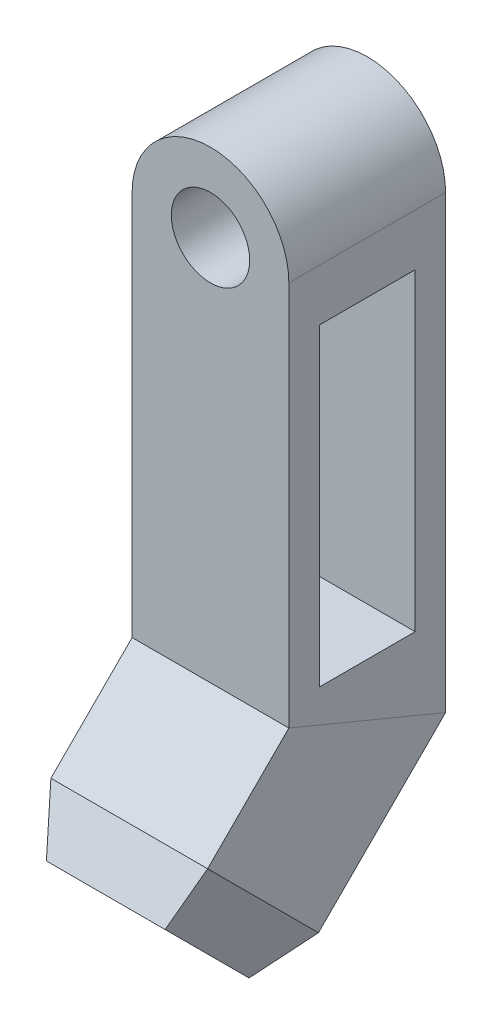
ISO-10303-21;
HEADER;
FILE_DESCRIPTION(('STEP AP214'),'2;1');
FILE_NAME('part.step','',(''),(''),'','','');
FILE_SCHEMA(('AUTOMOTIVE_DESIGN { 1 0 10303 214 1 1 1 1 }'));
ENDSEC;
DATA;
#1=APPLICATION_CONTEXT('core data for automotive mechanical design processes');
#2=APPLICATION_PROTOCOL_DEFINITION('international standard','automotive_design',2000,#1);
#3=PRODUCT_CONTEXT('',#1,'mechanical');
#4=PRODUCT('Part','Part','',(#3));
#5=PRODUCT_RELATED_PRODUCT_CATEGORY('part','',(#4));
#6=PRODUCT_DEFINITION_FORMATION('','',#4);
#7=PRODUCT_DEFINITION_CONTEXT('part definition',#1,'design');
#8=PRODUCT_DEFINITION('design','',#6,#7);
#9=PRODUCT_DEFINITION_SHAPE('','',#8);
#10=(LENGTH_UNIT() NAMED_UNIT(*) SI_UNIT(.MILLI.,.METRE.));
#11=(NAMED_UNIT(*) PLANE_ANGLE_UNIT() SI_UNIT($,.RADIAN.));
#12=(NAMED_UNIT(*) SI_UNIT($,.STERADIAN.) SOLID_ANGLE_UNIT());
#13=UNCERTAINTY_MEASURE_WITH_UNIT(LENGTH_MEASURE(1.E-05),#10,'distance_accuracy_value','');
#14=(GEOMETRIC_REPRESENTATION_CONTEXT(3) GLOBAL_UNCERTAINTY_ASSIGNED_CONTEXT((#13)) GLOBAL_UNIT_ASSIGNED_CONTEXT((#10,
#11,#12)) REPRESENTATION_CONTEXT('',''));
#15=CARTESIAN_POINT('',(0.,0.,0.));
#16=DIRECTION('',(0.,0.,1.));
#17=DIRECTION('',(1.,0.,0.));
#18=AXIS2_PLACEMENT_3D('',#15,#16,#17);
#19=CARTESIAN_POINT('',(19.05,14.4716722599583,7.26209610324911));
#20=DIRECTION('',(-1.,0.,0.));
#21=DIRECTION('',(0.,0.,1.));
#22=AXIS2_PLACEMENT_3D('',#19,#20,#21);
#23=PLANE('',#22);
#24=DIRECTION('',(0.,0.382683432365091,0.923879532511287));
#25=VECTOR('',#24,1.);
#26=CARTESIAN_POINT('',(19.05,16.4071676065253,52.1812165750785));
#27=LINE('',#26,#25);
#28=CARTESIAN_POINT('',(19.05,-13.0977683632075,-19.05));
#29=VERTEX_POINT('',#28);
#30=CARTESIAN_POINT('',(19.05,2.68376836320748,19.05));
#31=VERTEX_POINT('',#30);
#32=EDGE_CURVE('E244',#29,#31,#27,.T.);
#33=ORIENTED_EDGE('',*,*,#32,.T.);
#34=DIRECTION('',(0.,-0.707106781186546,0.707106781186549));
#35=VECTOR('',#34,1.);
#36=CARTESIAN_POINT('',(19.05,14.4716722599583,7.26209610324911));
#37=LINE('',#36,#35);
#38=CARTESIAN_POINT('',(19.05,-17.0609380798112,38.7947064430187));
#39=VERTEX_POINT('',#38);
#40=EDGE_CURVE('E49',#31,#39,#37,.T.);
#41=ORIENTED_EDGE('',*,*,#40,.T.);
#42=DIRECTION('',(0.,-0.707106781186549,-0.707106781186546));
#43=VECTOR('',#42,1.);
#44=CARTESIAN_POINT('',(19.05,-17.0609380798112,38.7947064430187));
#45=LINE('',#44,#43);
#46=CARTESIAN_POINT('',(19.05,-44.0017064430187,11.8539380798113));
#47=VERTEX_POINT('',#46);
#48=EDGE_CURVE('E283',#39,#47,#45,.T.);
#49=ORIENTED_EDGE('',*,*,#48,.T.);
#50=DIRECTION('',(0.,-0.707106781186546,0.707106781186549));
#51=VECTOR('',#50,1.);
#52=CARTESIAN_POINT('',(19.05,-12.4690961032492,-19.6786722599583));
#53=LINE('',#52,#51);
#54=EDGE_CURVE('E294',#29,#47,#53,.T.);
#55=ORIENTED_EDGE('',*,*,#54,.F.);
#56=EDGE_LOOP('',(#33,#41,#49,#55));
#57=FACE_BOUND('',#56,.T.);
#58=ADVANCED_FACE('F45',(#57),#23,.F.);
#59=CARTESIAN_POINT('',(-19.05,-12.4690961032492,-19.6786722599583));
#60=DIRECTION('',(0.,0.707106781186549,0.707106781186546));
#61=DIRECTION('',(0.,-0.707106781186546,0.707106781186549));
#62=AXIS2_PLACEMENT_3D('',#59,#60,#61);
#63=PLANE('',#62);
#64=DIRECTION('',(1.,0.,0.));
#65=VECTOR('',#64,1.);
#66=CARTESIAN_POINT('',(-19.05,-13.0977683632075,-19.05));
#67=LINE('',#66,#65);
#68=CARTESIAN_POINT('',(-19.05,-13.0977683632075,-19.05));
#69=VERTEX_POINT('',#68);
#70=EDGE_CURVE('E11',#69,#29,#67,.T.);
#71=ORIENTED_EDGE('',*,*,#70,.T.);
#72=ORIENTED_EDGE('',*,*,#54,.T.);
#73=DIRECTION('',(-1.,0.,0.));
#74=VECTOR('',#73,1.);
#75=CARTESIAN_POINT('',(-19.05,-44.0017064430187,11.8539380798113));
#76=LINE('',#75,#74);
#77=CARTESIAN_POINT('',(-19.05,-44.0017064430187,11.8539380798113));
#78=VERTEX_POINT('',#77);
#79=EDGE_CURVE('E279',#47,#78,#76,.T.);
#80=ORIENTED_EDGE('',*,*,#79,.T.);
#81=DIRECTION('',(0.,-0.707106781186546,0.707106781186549));
#82=VECTOR('',#81,1.);
#83=CARTESIAN_POINT('',(-19.05,-12.4690961032492,-19.6786722599583));
#84=LINE('',#83,#82);
#85=EDGE_CURVE('E291',#69,#78,#84,.T.);
#86=ORIENTED_EDGE('',*,*,#85,.F.);
#87=EDGE_LOOP('',(#71,#72,#80,#86));
#88=FACE_BOUND('',#87,.T.);
#89=ADVANCED_FACE('F322',(#88),#63,.F.);
#90=CARTESIAN_POINT('',(-19.05,14.4716722599583,7.26209610324911));
#91=DIRECTION('',(1.,0.,0.));
#92=DIRECTION('',(0.,0.,-1.));
#93=AXIS2_PLACEMENT_3D('',#90,#91,#92);
#94=PLANE('',#93);
#95=DIRECTION('',(0.,-0.382683432365091,-0.923879532511287));
#96=VECTOR('',#95,1.);
#97=CARTESIAN_POINT('',(-19.05,16.4071676065253,52.1812165750785));
#98=LINE('',#97,#96);
#99=CARTESIAN_POINT('',(-19.05,2.68376836320748,19.05));
#100=VERTEX_POINT('',#99);
#101=EDGE_CURVE('E55',#100,#69,#98,.T.);
#102=ORIENTED_EDGE('',*,*,#101,.T.);
#103=ORIENTED_EDGE('',*,*,#85,.T.);
#104=DIRECTION('',(0.,0.707106781186549,0.707106781186546));
#105=VECTOR('',#104,1.);
#106=CARTESIAN_POINT('',(-19.05,-17.0609380798112,38.7947064430187));
#107=LINE('',#106,#105);
#108=CARTESIAN_POINT('',(-19.05,-17.0609380798112,38.7947064430187));
#109=VERTEX_POINT('',#108);
#110=EDGE_CURVE('E275',#78,#109,#107,.T.);
#111=ORIENTED_EDGE('',*,*,#110,.T.);
#112=DIRECTION('',(0.,-0.707106781186546,0.707106781186549));
#113=VECTOR('',#112,1.);
#114=CARTESIAN_POINT('',(-19.05,14.4716722599583,7.26209610324911));
#115=LINE('',#114,#113);
#116=EDGE_CURVE('E287',#100,#109,#115,.T.);
#117=ORIENTED_EDGE('',*,*,#116,.F.);
#118=EDGE_LOOP('',(#102,#103,#111,#117));
#119=FACE_BOUND('',#118,.T.);
#120=ADVANCED_FACE('F313',(#119),#94,.F.);
#121=CARTESIAN_POINT('',(-19.05,14.4716722599583,7.26209610324911));
#122=DIRECTION('',(0.,-0.707106781186549,-0.707106781186546));
#123=DIRECTION('',(0.,0.707106781186546,-0.707106781186549));
#124=AXIS2_PLACEMENT_3D('',#121,#122,#123);
#125=PLANE('',#124);
#126=DIRECTION('',(-1.,0.,0.));
#127=VECTOR('',#126,1.);
#128=CARTESIAN_POINT('',(-19.05,2.68376836320748,19.05));
#129=LINE('',#128,#127);
#130=EDGE_CURVE('E240',#31,#100,#129,.T.);
#131=ORIENTED_EDGE('',*,*,#130,.T.);
#132=ORIENTED_EDGE('',*,*,#116,.T.);
#133=DIRECTION('',(1.,0.,0.));
#134=VECTOR('',#133,1.);
#135=CARTESIAN_POINT('',(-19.05,-17.0609380798112,38.7947064430187));
#136=LINE('',#135,#134);
#137=EDGE_CURVE('E213',#109,#39,#136,.T.);
#138=ORIENTED_EDGE('',*,*,#137,.T.);
#139=ORIENTED_EDGE('',*,*,#40,.F.);
#140=EDGE_LOOP('',(#131,#132,#138,#139));
#141=FACE_BOUND('',#140,.T.);
#142=ADVANCED_FACE('F47',(#141),#125,.F.);
#143=CARTESIAN_POINT('',(-19.05,96.393,19.05));
#144=DIRECTION('',(0.,0.,-1.));
#145=DIRECTION('',(0.,1.,0.));
#146=AXIS2_PLACEMENT_3D('',#143,#144,#145);
#147=PLANE('',#146);
#148=CARTESIAN_POINT('',(0.,96.393,19.05));
#149=DIRECTION('',(0.,0.,1.));
#150=DIRECTION('',(1.,0.,0.));
#151=AXIS2_PLACEMENT_3D('',#148,#149,#150);
#152=CIRCLE('',#151,9.525);
#153=CARTESIAN_POINT('',(9.525,96.393,19.05));
#154=VERTEX_POINT('',#153);
#155=EDGE_CURVE('E190',#154,#154,#152,.T.);
#156=ORIENTED_EDGE('',*,*,#155,.F.);
#157=EDGE_LOOP('',(#156));
#158=FACE_BOUND('',#157,.T.);
#159=DIRECTION('',(0.,-1.,0.));
#160=VECTOR('',#159,1.);
#161=CARTESIAN_POINT('',(19.05,96.393,19.05));
#162=LINE('',#161,#160);
#163=CARTESIAN_POINT('',(19.05,96.393,19.05));
#164=VERTEX_POINT('',#163);
#165=EDGE_CURVE('E255',#164,#31,#162,.T.);
#166=ORIENTED_EDGE('',*,*,#165,.F.);
#167=CARTESIAN_POINT('',(0.,96.393,19.05));
#168=DIRECTION('',(0.,0.,-1.));
#169=DIRECTION('',(0.,1.,0.));
#170=AXIS2_PLACEMENT_3D('',#167,#168,#169);
#171=CIRCLE('',#170,19.05);
#172=CARTESIAN_POINT('',(-19.05,96.393,19.05));
#173=VERTEX_POINT('',#172);
#174=EDGE_CURVE('E202',#164,#173,#171,.F.);
#175=ORIENTED_EDGE('',*,*,#174,.T.);
#176=DIRECTION('',(0.,-1.,0.));
#177=VECTOR('',#176,1.);
#178=CARTESIAN_POINT('',(-19.05,96.393,19.05));
#179=LINE('',#178,#177);
#180=EDGE_CURVE('E262',#173,#100,#179,.T.);
#181=ORIENTED_EDGE('',*,*,#180,.T.);
#182=ORIENTED_EDGE('',*,*,#130,.F.);
#183=EDGE_LOOP('',(#166,#175,#181,#182));
#184=FACE_BOUND('',#183,.T.);
#185=ADVANCED_FACE('F334',(#158,#184),#147,.F.);
#186=CARTESIAN_POINT('',(-19.05,96.393,19.05));
#187=DIRECTION('',(1.,0.,0.));
#188=DIRECTION('',(0.,0.,-1.));
#189=AXIS2_PLACEMENT_3D('',#186,#187,#188);
#190=PLANE('',#189);
#191=DIRECTION('',(0.,0.,1.));
#192=VECTOR('',#191,1.);
#193=CARTESIAN_POINT('',(-19.05,83.82,19.05));
#194=LINE('',#193,#192);
#195=CARTESIAN_POINT('',(-19.05,83.82,-11.6553005320456));
#196=VERTEX_POINT('',#195);
#197=CARTESIAN_POINT('',(-19.05,83.82,11.6553005320456));
#198=VERTEX_POINT('',#197);
#199=EDGE_CURVE('E177',#196,#198,#194,.T.);
#200=ORIENTED_EDGE('',*,*,#199,.T.);
#201=DIRECTION('',(0.,-1.,0.));
#202=VECTOR('',#201,1.);
#203=CARTESIAN_POINT('',(-19.05,96.393,11.6553005320456));
#204=LINE('',#203,#202);
#205=CARTESIAN_POINT('',(-19.05,7.62,11.6553005320452));
#206=VERTEX_POINT('',#205);
#207=EDGE_CURVE('E181',#198,#206,#204,.T.);
#208=ORIENTED_EDGE('',*,*,#207,.T.);
#209=DIRECTION('',(0.,0.,-1.));
#210=VECTOR('',#209,1.);
#211=CARTESIAN_POINT('',(-19.05,7.62,19.05));
#212=LINE('',#211,#210);
#213=CARTESIAN_POINT('',(-19.05,7.62,-11.6553005320456));
#214=VERTEX_POINT('',#213);
#215=EDGE_CURVE('E168',#206,#214,#212,.T.);
#216=ORIENTED_EDGE('',*,*,#215,.T.);
#217=DIRECTION('',(0.,1.,0.));
#218=VECTOR('',#217,1.);
#219=CARTESIAN_POINT('',(-19.05,96.393,-11.6553005320456));
#220=LINE('',#219,#218);
#221=EDGE_CURVE('E143',#214,#196,#220,.T.);
#222=ORIENTED_EDGE('',*,*,#221,.T.);
#223=EDGE_LOOP('',(#200,#208,#216,#222));
#224=FACE_BOUND('',#223,.T.);
#225=ORIENTED_EDGE('',*,*,#180,.F.);
#226=DIRECTION('',(0.,0.,1.));
#227=VECTOR('',#226,1.);
#228=CARTESIAN_POINT('',(-19.05,96.393,19.05));
#229=LINE('',#228,#227);
#230=CARTESIAN_POINT('',(-19.05,96.393,-19.05));
#231=VERTEX_POINT('',#230);
#232=EDGE_CURVE('E249',#231,#173,#229,.T.);
#233=ORIENTED_EDGE('',*,*,#232,.F.);
#234=DIRECTION('',(0.,-1.,0.));
#235=VECTOR('',#234,1.);
#236=CARTESIAN_POINT('',(-19.05,96.393,-19.05));
#237=LINE('',#236,#235);
#238=EDGE_CURVE('E254',#231,#69,#237,.T.);
#239=ORIENTED_EDGE('',*,*,#238,.T.);
#240=ORIENTED_EDGE('',*,*,#101,.F.);
#241=EDGE_LOOP('',(#225,#233,#239,#240));
#242=FACE_BOUND('',#241,.T.);
#243=ADVANCED_FACE('F325',(#224,#242),#190,.F.);
#244=CARTESIAN_POINT('',(-19.05,96.393,-19.05));
#245=DIRECTION('',(0.,0.,1.));
#246=DIRECTION('',(0.,-1.,0.));
#247=AXIS2_PLACEMENT_3D('',#244,#245,#246);
#248=PLANE('',#247);
#249=CARTESIAN_POINT('',(0.,96.393,-19.05));
#250=DIRECTION('',(0.,0.,1.));
#251=DIRECTION('',(1.,0.,0.));
#252=AXIS2_PLACEMENT_3D('',#249,#250,#251);
#253=CIRCLE('',#252,9.525);
#254=CARTESIAN_POINT('',(9.525,96.393,-19.05));
#255=VERTEX_POINT('',#254);
#256=EDGE_CURVE('E194',#255,#255,#253,.T.);
#257=ORIENTED_EDGE('',*,*,#256,.T.);
#258=EDGE_LOOP('',(#257));
#259=FACE_BOUND('',#258,.T.);
#260=ORIENTED_EDGE('',*,*,#238,.F.);
#261=CARTESIAN_POINT('',(0.,96.393,-19.05));
#262=DIRECTION('',(0.,0.,-1.));
#263=DIRECTION('',(0.,1.,0.));
#264=AXIS2_PLACEMENT_3D('',#261,#262,#263);
#265=CIRCLE('',#264,19.05);
#266=CARTESIAN_POINT('',(19.05,96.393,-19.05));
#267=VERTEX_POINT('',#266);
#268=EDGE_CURVE('E198',#231,#267,#265,.T.);
#269=ORIENTED_EDGE('',*,*,#268,.T.);
#270=DIRECTION('',(0.,-1.,0.));
#271=VECTOR('',#270,1.);
#272=CARTESIAN_POINT('',(19.05,96.393,-19.05));
#273=LINE('',#272,#271);
#274=EDGE_CURVE('E250',#267,#29,#273,.T.);
#275=ORIENTED_EDGE('',*,*,#274,.T.);
#276=ORIENTED_EDGE('',*,*,#70,.F.);
#277=EDGE_LOOP('',(#260,#269,#275,#276));
#278=FACE_BOUND('',#277,.T.);
#279=ADVANCED_FACE('F328',(#259,#278),#248,.F.);
#280=CARTESIAN_POINT('',(19.05,96.393,19.05));
#281=DIRECTION('',(-1.,0.,0.));
#282=DIRECTION('',(0.,0.,1.));
#283=AXIS2_PLACEMENT_3D('',#280,#281,#282);
#284=PLANE('',#283);
#285=DIRECTION('',(0.,0.,-1.));
#286=VECTOR('',#285,1.);
#287=CARTESIAN_POINT('',(19.05,7.62000000000001,-11.6553005320456));
#288=LINE('',#287,#286);
#289=CARTESIAN_POINT('',(19.05,7.62,11.6553005320452));
#290=VERTEX_POINT('',#289);
#291=CARTESIAN_POINT('',(19.05,7.62000000000001,-11.6553005320456));
#292=VERTEX_POINT('',#291);
#293=EDGE_CURVE('E150',#290,#292,#288,.T.);
#294=ORIENTED_EDGE('',*,*,#293,.F.);
#295=DIRECTION('',(0.,-1.,0.));
#296=VECTOR('',#295,1.);
#297=CARTESIAN_POINT('',(19.05,7.62,11.6553005320452));
#298=LINE('',#297,#296);
#299=CARTESIAN_POINT('',(19.05,83.82,11.6553005320456));
#300=VERTEX_POINT('',#299);
#301=EDGE_CURVE('E71',#300,#290,#298,.T.);
#302=ORIENTED_EDGE('',*,*,#301,.F.);
#303=DIRECTION('',(0.,0.,1.));
#304=VECTOR('',#303,1.);
#305=CARTESIAN_POINT('',(19.05,83.82,11.6553005320456));
#306=LINE('',#305,#304);
#307=CARTESIAN_POINT('',(19.05,83.82,-11.6553005320456));
#308=VERTEX_POINT('',#307);
#309=EDGE_CURVE('E158',#308,#300,#306,.T.);
#310=ORIENTED_EDGE('',*,*,#309,.F.);
#311=DIRECTION('',(0.,1.,0.));
#312=VECTOR('',#311,1.);
#313=CARTESIAN_POINT('',(19.05,83.82,-11.6553005320456));
#314=LINE('',#313,#312);
#315=EDGE_CURVE('E140',#292,#308,#314,.T.);
#316=ORIENTED_EDGE('',*,*,#315,.F.);
#317=EDGE_LOOP('',(#294,#302,#310,#316));
#318=FACE_BOUND('',#317,.T.);
#319=ORIENTED_EDGE('',*,*,#274,.F.);
#320=DIRECTION('',(0.,0.,-1.));
#321=VECTOR('',#320,1.);
#322=CARTESIAN_POINT('',(19.05,96.393,19.05));
#323=LINE('',#322,#321);
#324=EDGE_CURVE('E245',#164,#267,#323,.T.);
#325=ORIENTED_EDGE('',*,*,#324,.F.);
#326=ORIENTED_EDGE('',*,*,#165,.T.);
#327=ORIENTED_EDGE('',*,*,#32,.F.);
#328=EDGE_LOOP('',(#319,#325,#326,#327));
#329=FACE_BOUND('',#328,.T.);
#330=ADVANCED_FACE('F155',(#318,#329),#284,.F.);
#331=CARTESIAN_POINT('',(19.05,-17.0609380798112,38.7947064430187));
#332=DIRECTION('',(0.,0.4226182617407,0.906307787036649));
#333=DIRECTION('',(0.,-0.90630778703665,0.4226182617407));
#334=AXIS2_PLACEMENT_3D('',#331,#332,#333);
#335=PLANE('',#334);
#336=ORIENTED_EDGE('',*,*,#137,.F.);
#337=DIRECTION('',(-0.323615577118185,0.857538139995739,-0.399876601840008));
#338=VECTOR('',#337,1.);
#339=CARTESIAN_POINT('',(-19.05,-17.0609380798112,38.7947064430187));
#340=LINE('',#339,#338);
#341=CARTESIAN_POINT('',(-14.4275780248192,-29.3097401250364,44.5064166399319));
#342=VERTEX_POINT('',#341);
#343=EDGE_CURVE('E210',#342,#109,#340,.T.);
#344=ORIENTED_EDGE('',*,*,#343,.F.);
#345=DIRECTION('',(1.,0.,0.));
#346=VECTOR('',#345,1.);
#347=CARTESIAN_POINT('',(19.05,-29.3097401250364,44.5064166399319));
#348=LINE('',#347,#346);
#349=CARTESIAN_POINT('',(14.4275780248192,-29.3097401250364,44.5064166399319));
#350=VERTEX_POINT('',#349);
#351=EDGE_CURVE('E206',#350,#342,#348,.F.);
#352=ORIENTED_EDGE('',*,*,#351,.F.);
#353=DIRECTION('',(0.323615577118185,0.857538139995739,-0.399876601840008));
#354=VECTOR('',#353,1.);
#355=CARTESIAN_POINT('',(19.05,-17.0609380798112,38.7947064430187));
#356=LINE('',#355,#354);
#357=EDGE_CURVE('E215',#350,#39,#356,.T.);
#358=ORIENTED_EDGE('',*,*,#357,.T.);
#359=EDGE_LOOP('',(#336,#344,#352,#358));
#360=FACE_BOUND('',#359,.T.);
#361=ADVANCED_FACE('F309',(#360),#335,.T.);
#362=CARTESIAN_POINT('',(-19.05,-17.0609380798112,38.7947064430187));
#363=DIRECTION('',(-0.939692620785908,-0.241844762647975,0.241844762647976));
#364=DIRECTION('',(0.249243569363955,0.,0.968440830991091));
#365=AXIS2_PLACEMENT_3D('',#362,#363,#364);
#366=PLANE('',#365);
#367=ORIENTED_EDGE('',*,*,#110,.F.);
#368=DIRECTION('',(-0.323615577118185,0.399876601840004,-0.857538139995741));
#369=VECTOR('',#368,1.);
#370=CARTESIAN_POINT('',(-19.05,-44.0017064430187,11.8539380798113));
#371=LINE('',#370,#369);
#372=CARTESIAN_POINT('',(-14.4275780248192,-49.7134166399318,24.1027401250365));
#373=VERTEX_POINT('',#372);
#374=EDGE_CURVE('E214',#373,#78,#371,.T.);
#375=ORIENTED_EDGE('',*,*,#374,.F.);
#376=DIRECTION('',(0.,0.707106781186549,0.707106781186546));
#377=VECTOR('',#376,1.);
#378=CARTESIAN_POINT('',(-14.4275780248192,-26.0411942008804,47.7749625640879));
#379=LINE('',#378,#377);
#380=EDGE_CURVE('E229',#342,#373,#379,.F.);
#381=ORIENTED_EDGE('',*,*,#380,.F.);
#382=ORIENTED_EDGE('',*,*,#343,.T.);
#383=EDGE_LOOP('',(#367,#375,#381,#382));
#384=FACE_BOUND('',#383,.T.);
#385=ADVANCED_FACE('F317',(#384),#366,.T.);
#386=CARTESIAN_POINT('',(-19.05,-44.0017064430187,11.8539380798113));
#387=DIRECTION('',(0.,-0.906307787036651,-0.422618261740697));
#388=DIRECTION('',(0.,0.422618261740697,-0.906307787036651));
#389=AXIS2_PLACEMENT_3D('',#386,#387,#388);
#390=PLANE('',#389);
#391=ORIENTED_EDGE('',*,*,#79,.F.);
#392=DIRECTION('',(0.323615577118185,0.399876601840004,-0.857538139995741));
#393=VECTOR('',#392,1.);
#394=CARTESIAN_POINT('',(19.05,-44.0017064430187,11.8539380798113));
#395=LINE('',#394,#393);
#396=CARTESIAN_POINT('',(14.4275780248192,-49.7134166399318,24.1027401250365));
#397=VERTEX_POINT('',#396);
#398=EDGE_CURVE('E218',#397,#47,#395,.T.);
#399=ORIENTED_EDGE('',*,*,#398,.F.);
#400=DIRECTION('',(-1.,0.,0.));
#401=VECTOR('',#400,1.);
#402=CARTESIAN_POINT('',(-19.05,-49.7134166399318,24.1027401250365));
#403=LINE('',#402,#401);
#404=EDGE_CURVE('E232',#373,#397,#403,.F.);
#405=ORIENTED_EDGE('',*,*,#404,.F.);
#406=ORIENTED_EDGE('',*,*,#374,.T.);
#407=EDGE_LOOP('',(#391,#399,#405,#406));
#408=FACE_BOUND('',#407,.T.);
#409=ADVANCED_FACE('F320',(#408),#390,.T.);
#410=CARTESIAN_POINT('',(19.05,-44.0017064430187,11.8539380798113));
#411=DIRECTION('',(0.939692620785908,-0.241844762647975,0.241844762647976));
#412=DIRECTION('',(0.249243569363955,0.,-0.968440830991091));
#413=AXIS2_PLACEMENT_3D('',#410,#411,#412);
#414=PLANE('',#413);
#415=ORIENTED_EDGE('',*,*,#48,.F.);
#416=ORIENTED_EDGE('',*,*,#357,.F.);
#417=DIRECTION('',(0.,-0.707106781186549,-0.707106781186546));
#418=VECTOR('',#417,1.);
#419=CARTESIAN_POINT('',(14.4275780248192,-52.9819625640879,20.8341942008805));
#420=LINE('',#419,#418);
#421=EDGE_CURVE('E219',#397,#350,#420,.F.);
#422=ORIENTED_EDGE('',*,*,#421,.F.);
#423=ORIENTED_EDGE('',*,*,#398,.T.);
#424=EDGE_LOOP('',(#415,#416,#422,#423));
#425=FACE_BOUND('',#424,.T.);
#426=ADVANCED_FACE('F362',(#425),#414,.T.);
#427=CARTESIAN_POINT('',(0.,-36.9080783824841,36.9080783824842));
#428=DIRECTION('',(0.,-0.707106781186546,0.707106781186549));
#429=DIRECTION('',(0.,-0.707106781186549,-0.707106781186546));
#430=AXIS2_PLACEMENT_3D('',#427,#428,#429);
#431=PLANE('',#430);
#432=CARTESIAN_POINT('',(0.,-39.5115783824841,34.3045783824842));
#433=DIRECTION('',(0.,-0.707106781186546,0.707106781186549));
#434=DIRECTION('',(0.,-0.707106781186549,-0.707106781186546));
#435=AXIS2_PLACEMENT_3D('',#432,#433,#434);
#436=CIRCLE('',#435,12.065);
#437=CARTESIAN_POINT('',(0.,-48.0428216974998,25.7733350674685));
#438=VERTEX_POINT('',#437);
#439=EDGE_CURVE('E185',#438,#438,#436,.T.);
#440=ORIENTED_EDGE('',*,*,#439,.F.);
#441=EDGE_LOOP('',(#440));
#442=FACE_BOUND('',#441,.T.);
#443=ORIENTED_EDGE('',*,*,#351,.T.);
#444=ORIENTED_EDGE('',*,*,#380,.T.);
#445=ORIENTED_EDGE('',*,*,#404,.T.);
#446=ORIENTED_EDGE('',*,*,#421,.T.);
#447=EDGE_LOOP('',(#443,#444,#445,#446));
#448=FACE_BOUND('',#447,.T.);
#449=ADVANCED_FACE('F364',(#442,#448),#431,.T.);
#450=CARTESIAN_POINT('',(0.,96.393,61.647094971371));
#451=DIRECTION('',(0.,0.,-1.));
#452=DIRECTION('',(0.,1.,0.));
#453=AXIS2_PLACEMENT_3D('',#450,#451,#452);
#454=CYLINDRICAL_SURFACE('',#453,19.05);
#455=ORIENTED_EDGE('',*,*,#174,.F.);
#456=ORIENTED_EDGE('',*,*,#324,.T.);
#457=ORIENTED_EDGE('',*,*,#268,.F.);
#458=ORIENTED_EDGE('',*,*,#232,.T.);
#459=EDGE_LOOP('',(#455,#456,#457,#458));
#460=FACE_BOUND('',#459,.T.);
#461=ADVANCED_FACE('F331',(#460),#454,.T.);
#462=CARTESIAN_POINT('',(0.,96.393,-19.05));
#463=DIRECTION('',(0.,0.,1.));
#464=DIRECTION('',(1.,0.,0.));
#465=AXIS2_PLACEMENT_3D('',#462,#463,#464);
#466=CYLINDRICAL_SURFACE('',#465,9.525);
#467=CARTESIAN_POINT('',(9.525,96.393,-19.05));
#468=CARTESIAN_POINT('',(9.525,96.393,-18.653125));
#469=CARTESIAN_POINT('',(9.525,96.393,-18.25625));
#470=CARTESIAN_POINT('',(9.525,96.393,-17.4625));
#471=CARTESIAN_POINT('',(9.525,96.393,-17.065625));
#472=CARTESIAN_POINT('',(9.525,96.393,-16.271875));
#473=CARTESIAN_POINT('',(9.525,96.393,-15.875));
#474=CARTESIAN_POINT('',(9.525,96.393,-15.08125));
#475=CARTESIAN_POINT('',(9.525,96.393,-14.684375));
#476=CARTESIAN_POINT('',(9.525,96.393,-13.890625));
#477=CARTESIAN_POINT('',(9.525,96.393,-13.49375));
#478=CARTESIAN_POINT('',(9.525,96.393,-12.7));
#479=CARTESIAN_POINT('',(9.525,96.393,-12.303125));
#480=CARTESIAN_POINT('',(9.525,96.393,-11.509375));
#481=CARTESIAN_POINT('',(9.525,96.393,-11.1125));
#482=CARTESIAN_POINT('',(9.525,96.393,-10.31875));
#483=CARTESIAN_POINT('',(9.525,96.393,-9.92187500000001));
#484=CARTESIAN_POINT('',(9.525,96.393,-9.12812500000001));
#485=CARTESIAN_POINT('',(9.525,96.393,-8.73125000000001));
#486=CARTESIAN_POINT('',(9.525,96.393,-7.93750000000001));
#487=CARTESIAN_POINT('',(9.525,96.393,-7.54062500000001));
#488=CARTESIAN_POINT('',(9.525,96.393,-6.74687500000001));
#489=CARTESIAN_POINT('',(9.525,96.393,-6.35000000000001));
#490=CARTESIAN_POINT('',(9.525,96.393,-5.55625000000001));
#491=CARTESIAN_POINT('',(9.525,96.393,-5.15937500000001));
#492=CARTESIAN_POINT('',(9.525,96.393,-4.36562500000001));
#493=CARTESIAN_POINT('',(9.525,96.393,-3.96875000000001));
#494=CARTESIAN_POINT('',(9.525,96.393,-3.17500000000001));
#495=CARTESIAN_POINT('',(9.525,96.393,-2.77812500000001));
#496=CARTESIAN_POINT('',(9.525,96.393,-1.98437500000001));
#497=CARTESIAN_POINT('',(9.525,96.393,-1.58750000000001));
#498=CARTESIAN_POINT('',(9.525,96.393,-0.793750000000011));
#499=CARTESIAN_POINT('',(9.525,96.393,-0.396875000000011));
#500=CARTESIAN_POINT('',(9.525,96.393,0.39687499999999));
#501=CARTESIAN_POINT('',(9.525,96.393,0.79374999999999));
#502=CARTESIAN_POINT('',(9.525,96.393,1.58749999999999));
#503=CARTESIAN_POINT('',(9.525,96.393,1.98437499999999));
#504=CARTESIAN_POINT('',(9.525,96.393,2.77812499999999));
#505=CARTESIAN_POINT('',(9.525,96.393,3.17499999999999));
#506=CARTESIAN_POINT('',(9.525,96.393,3.96874999999999));
#507=CARTESIAN_POINT('',(9.525,96.393,4.36562499999999));
#508=CARTESIAN_POINT('',(9.525,96.393,5.15937499999999));
#509=CARTESIAN_POINT('',(9.525,96.393,5.55624999999999));
#510=CARTESIAN_POINT('',(9.525,96.393,6.34999999999999));
#511=CARTESIAN_POINT('',(9.525,96.393,6.74687499999999));
#512=CARTESIAN_POINT('',(9.525,96.393,7.54062499999999));
#513=CARTESIAN_POINT('',(9.525,96.393,7.93749999999999));
#514=CARTESIAN_POINT('',(9.525,96.393,8.73124999999999));
#515=CARTESIAN_POINT('',(9.525,96.393,9.12812499999999));
#516=CARTESIAN_POINT('',(9.525,96.393,9.92187499999999));
#517=CARTESIAN_POINT('',(9.525,96.393,10.31875));
#518=CARTESIAN_POINT('',(9.525,96.393,11.1125));
#519=CARTESIAN_POINT('',(9.525,96.393,11.509375));
#520=CARTESIAN_POINT('',(9.525,96.393,12.303125));
#521=CARTESIAN_POINT('',(9.525,96.393,12.7));
#522=CARTESIAN_POINT('',(9.525,96.393,13.49375));
#523=CARTESIAN_POINT('',(9.525,96.393,13.890625));
#524=CARTESIAN_POINT('',(9.525,96.393,14.684375));
#525=CARTESIAN_POINT('',(9.525,96.393,15.08125));
#526=CARTESIAN_POINT('',(9.525,96.393,15.875));
#527=CARTESIAN_POINT('',(9.525,96.393,16.271875));
#528=CARTESIAN_POINT('',(9.525,96.393,17.065625));
#529=CARTESIAN_POINT('',(9.525,96.393,17.4625));
#530=CARTESIAN_POINT('',(9.525,96.393,18.25625));
#531=CARTESIAN_POINT('',(9.525,96.393,18.653125));
#532=CARTESIAN_POINT('',(9.525,96.393,19.05));
#533=B_SPLINE_CURVE_WITH_KNOTS('',3,(#467,#468,#469,#470,#471,#472,#473,#474,#475,#476,#477,
#478,#479,#480,#481,#482,#483,#484,#485,#486,#487,#488,#489,#490,#491,#492,#493,#494,#495,#496,
#497,#498,#499,#500,#501,#502,#503,#504,#505,#506,#507,#508,#509,#510,#511,#512,#513,#514,#515,
#516,#517,#518,#519,#520,#521,#522,#523,#524,#525,#526,#527,#528,#529,#530,#531,#532),
.UNSPECIFIED.,.F.,.F.,(4,2,2,2,2,2,2,2,2,2,2,2,2,2,2,2,2,2,2,2,2,2,2,2,2,2,2,2,2,2,2,2,4),(0.,
1.190625,2.38125,3.571875,4.7625,5.953125,7.14375,8.334375,9.525,10.715625,11.90625,13.096875,
14.2875,15.478125,16.66875,17.859375,19.05,20.240625,21.43125,22.621875,23.8125,25.003125,
26.19375,27.384375,28.575,29.765625,30.95625,32.146875,33.3375,34.528125,35.71875,36.909375,
38.1),.UNSPECIFIED.);
#534=EDGE_CURVE('BSEAM371',#255,#154,#533,.T.);
#535=ORIENTED_EDGE('',*,*,#256,.F.);
#536=ORIENTED_EDGE('',*,*,#155,.T.);
#537=ORIENTED_EDGE('',*,*,#534,.T.);
#538=ORIENTED_EDGE('',*,*,#534,.F.);
#539=EDGE_LOOP('',(#535,#537,#536,#538));
#540=FACE_BOUND('',#539,.T.);
#541=ADVANCED_FACE('F371',(#540),#466,.F.);
#542=CARTESIAN_POINT('',(0.,-30.531322261415,25.324322261415));
#543=DIRECTION('',(0.,-0.707106781186546,0.707106781186549));
#544=DIRECTION('',(0.,-0.707106781186549,-0.707106781186546));
#545=AXIS2_PLACEMENT_3D('',#542,#543,#544);
#546=CYLINDRICAL_SURFACE('',#545,12.065);
#547=CARTESIAN_POINT('',(0.,-30.531322261415,25.324322261415));
#548=DIRECTION('',(0.,-0.707106781186546,0.707106781186549));
#549=DIRECTION('',(0.,-0.707106781186549,-0.707106781186546));
#550=AXIS2_PLACEMENT_3D('',#547,#548,#549);
#551=CIRCLE('',#550,12.065);
#552=CARTESIAN_POINT('',(0.,-39.0625655764307,16.7930789463994));
#553=VERTEX_POINT('',#552);
#554=EDGE_CURVE('E186',#553,#553,#551,.T.);
#555=ORIENTED_EDGE('',*,*,#554,.F.);
#556=EDGE_LOOP('',(#555));
#557=FACE_BOUND('',#556,.T.);
#558=ORIENTED_EDGE('',*,*,#439,.T.);
#559=EDGE_LOOP('',(#558));
#560=FACE_BOUND('',#559,.T.);
#561=ADVANCED_FACE('F374',(#557,#560),#546,.F.);
#562=CARTESIAN_POINT('',(0.,-30.531322261415,25.324322261415));
#563=DIRECTION('',(0.,-0.707106781186546,0.707106781186549));
#564=DIRECTION('',(0.,-0.707106781186549,-0.707106781186546));
#565=AXIS2_PLACEMENT_3D('',#562,#563,#564);
#566=PLANE('',#565);
#567=ORIENTED_EDGE('',*,*,#554,.T.);
#568=EDGE_LOOP('',(#567));
#569=FACE_BOUND('',#568,.T.);
#570=ADVANCED_FACE('F378',(#569),#566,.T.);
#571=CARTESIAN_POINT('',(-40.7806757928861,7.62,11.6553005320452));
#572=DIRECTION('',(0.,0.,1.));
#573=DIRECTION('',(0.,-1.,0.));
#574=AXIS2_PLACEMENT_3D('',#571,#572,#573);
#575=PLANE('',#574);
#576=DIRECTION('',(1.,0.,0.));
#577=VECTOR('',#576,1.);
#578=CARTESIAN_POINT('',(-40.7806757928861,83.82,11.6553005320456));
#579=LINE('',#578,#577);
#580=EDGE_CURVE('E165',#198,#300,#579,.T.);
#581=ORIENTED_EDGE('',*,*,#580,.T.);
#582=ORIENTED_EDGE('',*,*,#301,.T.);
#583=DIRECTION('',(1.,0.,0.));
#584=VECTOR('',#583,1.);
#585=CARTESIAN_POINT('',(-40.7806757928861,7.62,11.6553005320452));
#586=LINE('',#585,#584);
#587=EDGE_CURVE('E147',#206,#290,#586,.T.);
#588=ORIENTED_EDGE('',*,*,#587,.F.);
#589=ORIENTED_EDGE('',*,*,#207,.F.);
#590=EDGE_LOOP('',(#581,#582,#588,#589));
#591=FACE_BOUND('',#590,.T.);
#592=ADVANCED_FACE('F382',(#591),#575,.F.);
#593=CARTESIAN_POINT('',(-40.7806757928861,83.82,11.6553005320456));
#594=DIRECTION('',(0.,1.,0.));
#595=DIRECTION('',(0.,0.,1.));
#596=AXIS2_PLACEMENT_3D('',#593,#594,#595);
#597=PLANE('',#596);
#598=DIRECTION('',(1.,0.,0.));
#599=VECTOR('',#598,1.);
#600=CARTESIAN_POINT('',(-40.7806757928861,83.82,-11.6553005320456));
#601=LINE('',#600,#599);
#602=EDGE_CURVE('E146',#196,#308,#601,.T.);
#603=ORIENTED_EDGE('',*,*,#602,.T.);
#604=ORIENTED_EDGE('',*,*,#309,.T.);
#605=ORIENTED_EDGE('',*,*,#580,.F.);
#606=ORIENTED_EDGE('',*,*,#199,.F.);
#607=EDGE_LOOP('',(#603,#604,#605,#606));
#608=FACE_BOUND('',#607,.T.);
#609=ADVANCED_FACE('F385',(#608),#597,.F.);
#610=CARTESIAN_POINT('',(-40.7806757928861,83.82,-11.6553005320456));
#611=DIRECTION('',(0.,0.,-1.));
#612=DIRECTION('',(0.,1.,0.));
#613=AXIS2_PLACEMENT_3D('',#610,#611,#612);
#614=PLANE('',#613);
#615=DIRECTION('',(1.,0.,0.));
#616=VECTOR('',#615,1.);
#617=CARTESIAN_POINT('',(-40.7806757928861,7.62000000000001,-11.6553005320456));
#618=LINE('',#617,#616);
#619=EDGE_CURVE('E63',#214,#292,#618,.T.);
#620=ORIENTED_EDGE('',*,*,#619,.T.);
#621=ORIENTED_EDGE('',*,*,#315,.T.);
#622=ORIENTED_EDGE('',*,*,#602,.F.);
#623=ORIENTED_EDGE('',*,*,#221,.F.);
#624=EDGE_LOOP('',(#620,#621,#622,#623));
#625=FACE_BOUND('',#624,.T.);
#626=ADVANCED_FACE('F137',(#625),#614,.F.);
#627=CARTESIAN_POINT('',(-40.7806757928861,7.62000000000001,-11.6553005320456));
#628=DIRECTION('',(0.,-1.,0.));
#629=DIRECTION('',(0.,0.,-1.));
#630=AXIS2_PLACEMENT_3D('',#627,#628,#629);
#631=PLANE('',#630);
#632=ORIENTED_EDGE('',*,*,#587,.T.);
#633=ORIENTED_EDGE('',*,*,#293,.T.);
#634=ORIENTED_EDGE('',*,*,#619,.F.);
#635=ORIENTED_EDGE('',*,*,#215,.F.);
#636=EDGE_LOOP('',(#632,#633,#634,#635));
#637=FACE_BOUND('',#636,.T.);
#638=ADVANCED_FACE('F151',(#637),#631,.F.);
#639=CLOSED_SHELL('',(#58,#89,#120,#142,#185,#243,#279,#330,#361,#385,#409,#426,#449,#461,#541,
#561,#570,#592,#609,#626,#638));
#640=MANIFOLD_SOLID_BREP('B2',#639);
#641=ADVANCED_BREP_SHAPE_REPRESENTATION('',(#18,#640),#14);
#642=SHAPE_DEFINITION_REPRESENTATION(#9,#641);
ENDSEC;
END-ISO-10303-21;
